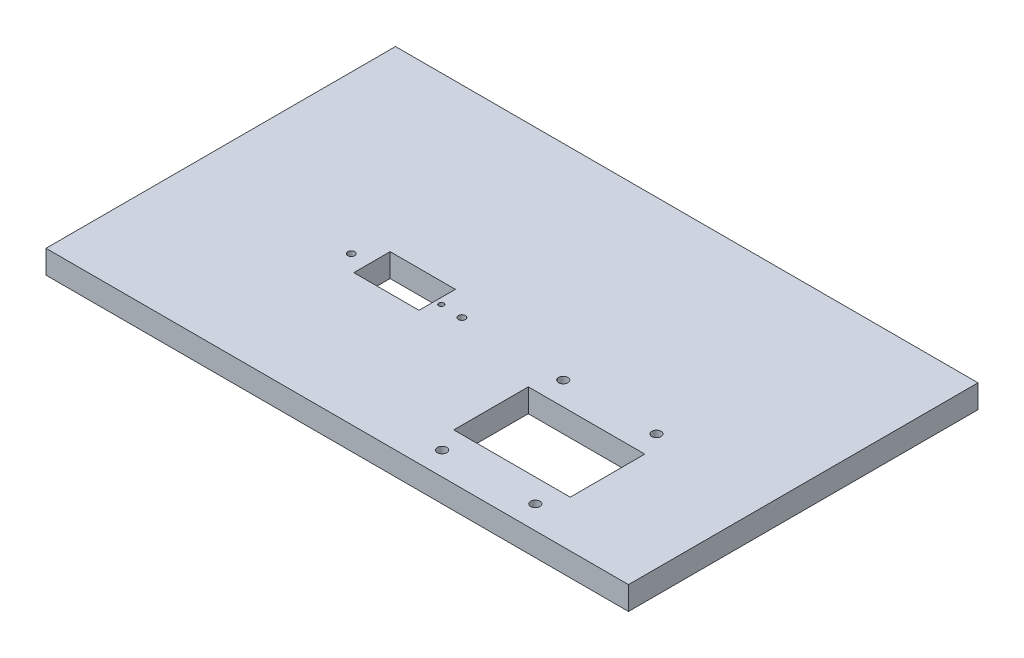
ISO-10303-21;
HEADER;
FILE_DESCRIPTION(('STEP AP214'),'2;1');
FILE_NAME('part.step','',(''),(''),'','','');
FILE_SCHEMA(('AUTOMOTIVE_DESIGN { 1 0 10303 214 1 1 1 1 }'));
ENDSEC;
DATA;
#1=APPLICATION_CONTEXT('core data for automotive mechanical design processes');
#2=APPLICATION_PROTOCOL_DEFINITION('international standard','automotive_design',2000,#1);
#3=PRODUCT_CONTEXT('',#1,'mechanical');
#4=PRODUCT('Part','Part','',(#3));
#5=PRODUCT_RELATED_PRODUCT_CATEGORY('part','',(#4));
#6=PRODUCT_DEFINITION_FORMATION('','',#4);
#7=PRODUCT_DEFINITION_CONTEXT('part definition',#1,'design');
#8=PRODUCT_DEFINITION('design','',#6,#7);
#9=PRODUCT_DEFINITION_SHAPE('','',#8);
#10=(LENGTH_UNIT() NAMED_UNIT(*) SI_UNIT(.MILLI.,.METRE.));
#11=(NAMED_UNIT(*) PLANE_ANGLE_UNIT() SI_UNIT($,.RADIAN.));
#12=(NAMED_UNIT(*) SI_UNIT($,.STERADIAN.) SOLID_ANGLE_UNIT());
#13=UNCERTAINTY_MEASURE_WITH_UNIT(LENGTH_MEASURE(1.E-05),#10,'distance_accuracy_value','');
#14=(GEOMETRIC_REPRESENTATION_CONTEXT(3) GLOBAL_UNCERTAINTY_ASSIGNED_CONTEXT((#13)) GLOBAL_UNIT_ASSIGNED_CONTEXT((#10,
#11,#12)) REPRESENTATION_CONTEXT('',''));
#15=CARTESIAN_POINT('',(0.,0.,0.));
#16=DIRECTION('',(0.,0.,1.));
#17=DIRECTION('',(1.,0.,0.));
#18=AXIS2_PLACEMENT_3D('',#15,#16,#17);
#19=CARTESIAN_POINT('',(125.,10.,-75.));
#20=DIRECTION('',(-1.,0.,0.));
#21=DIRECTION('',(0.,0.,1.));
#22=AXIS2_PLACEMENT_3D('',#19,#20,#21);
#23=PLANE('',#22);
#24=DIRECTION('',(0.,0.,-1.));
#25=VECTOR('',#24,1.);
#26=CARTESIAN_POINT('',(125.,0.,-75.));
#27=LINE('',#26,#25);
#28=CARTESIAN_POINT('',(125.,0.,75.));
#29=VERTEX_POINT('',#28);
#30=CARTESIAN_POINT('',(125.,0.,-75.));
#31=VERTEX_POINT('',#30);
#32=EDGE_CURVE('E258',#29,#31,#27,.T.);
#33=ORIENTED_EDGE('',*,*,#32,.T.);
#34=DIRECTION('',(0.,-1.,0.));
#35=VECTOR('',#34,1.);
#36=CARTESIAN_POINT('',(125.,10.,-75.));
#37=LINE('',#36,#35);
#38=CARTESIAN_POINT('',(125.,10.,-75.));
#39=VERTEX_POINT('',#38);
#40=EDGE_CURVE('E11',#39,#31,#37,.T.);
#41=ORIENTED_EDGE('',*,*,#40,.F.);
#42=DIRECTION('',(0.,0.,-1.));
#43=VECTOR('',#42,1.);
#44=CARTESIAN_POINT('',(125.,10.,-75.));
#45=LINE('',#44,#43);
#46=CARTESIAN_POINT('',(125.,10.,75.));
#47=VERTEX_POINT('',#46);
#48=EDGE_CURVE('E262',#47,#39,#45,.T.);
#49=ORIENTED_EDGE('',*,*,#48,.F.);
#50=DIRECTION('',(0.,-1.,0.));
#51=VECTOR('',#50,1.);
#52=CARTESIAN_POINT('',(125.,10.,75.));
#53=LINE('',#52,#51);
#54=EDGE_CURVE('E276',#47,#29,#53,.T.);
#55=ORIENTED_EDGE('',*,*,#54,.T.);
#56=EDGE_LOOP('',(#33,#41,#49,#55));
#57=FACE_BOUND('',#56,.T.);
#58=ADVANCED_FACE('F44',(#57),#23,.F.);
#59=CARTESIAN_POINT('',(-125.,10.,-75.));
#60=DIRECTION('',(0.,0.,1.));
#61=DIRECTION('',(1.,0.,0.));
#62=AXIS2_PLACEMENT_3D('',#59,#60,#61);
#63=PLANE('',#62);
#64=DIRECTION('',(-1.,0.,0.));
#65=VECTOR('',#64,1.);
#66=CARTESIAN_POINT('',(-125.,0.,-75.));
#67=LINE('',#66,#65);
#68=CARTESIAN_POINT('',(-125.,0.,-75.));
#69=VERTEX_POINT('',#68);
#70=EDGE_CURVE('E280',#31,#69,#67,.T.);
#71=ORIENTED_EDGE('',*,*,#70,.T.);
#72=DIRECTION('',(0.,-1.,0.));
#73=VECTOR('',#72,1.);
#74=CARTESIAN_POINT('',(-125.,10.,-75.));
#75=LINE('',#74,#73);
#76=CARTESIAN_POINT('',(-125.,10.,-75.));
#77=VERTEX_POINT('',#76);
#78=EDGE_CURVE('E52',#77,#69,#75,.T.);
#79=ORIENTED_EDGE('',*,*,#78,.F.);
#80=DIRECTION('',(-1.,0.,0.));
#81=VECTOR('',#80,1.);
#82=CARTESIAN_POINT('',(-125.,10.,-75.));
#83=LINE('',#82,#81);
#84=EDGE_CURVE('E266',#39,#77,#83,.T.);
#85=ORIENTED_EDGE('',*,*,#84,.F.);
#86=ORIENTED_EDGE('',*,*,#40,.T.);
#87=EDGE_LOOP('',(#71,#79,#85,#86));
#88=FACE_BOUND('',#87,.T.);
#89=ADVANCED_FACE('F315',(#88),#63,.F.);
#90=CARTESIAN_POINT('',(-125.,10.,-75.));
#91=DIRECTION('',(1.,0.,0.));
#92=DIRECTION('',(0.,0.,-1.));
#93=AXIS2_PLACEMENT_3D('',#90,#91,#92);
#94=PLANE('',#93);
#95=DIRECTION('',(0.,0.,1.));
#96=VECTOR('',#95,1.);
#97=CARTESIAN_POINT('',(-125.,0.,-75.));
#98=LINE('',#97,#96);
#99=CARTESIAN_POINT('',(-125.,0.,75.));
#100=VERTEX_POINT('',#99);
#101=EDGE_CURVE('E283',#69,#100,#98,.T.);
#102=ORIENTED_EDGE('',*,*,#101,.T.);
#103=DIRECTION('',(0.,-1.,0.));
#104=VECTOR('',#103,1.);
#105=CARTESIAN_POINT('',(-125.,10.,75.));
#106=LINE('',#105,#104);
#107=CARTESIAN_POINT('',(-125.,10.,75.));
#108=VERTEX_POINT('',#107);
#109=EDGE_CURVE('E291',#108,#100,#106,.T.);
#110=ORIENTED_EDGE('',*,*,#109,.F.);
#111=DIRECTION('',(0.,0.,1.));
#112=VECTOR('',#111,1.);
#113=CARTESIAN_POINT('',(-125.,10.,-75.));
#114=LINE('',#113,#112);
#115=EDGE_CURVE('E270',#77,#108,#114,.T.);
#116=ORIENTED_EDGE('',*,*,#115,.F.);
#117=ORIENTED_EDGE('',*,*,#78,.T.);
#118=EDGE_LOOP('',(#102,#110,#116,#117));
#119=FACE_BOUND('',#118,.T.);
#120=ADVANCED_FACE('F300',(#119),#94,.F.);
#121=CARTESIAN_POINT('',(-125.,10.,75.));
#122=DIRECTION('',(0.,0.,-1.));
#123=DIRECTION('',(-1.,0.,0.));
#124=AXIS2_PLACEMENT_3D('',#121,#122,#123);
#125=PLANE('',#124);
#126=DIRECTION('',(1.,0.,0.));
#127=VECTOR('',#126,1.);
#128=CARTESIAN_POINT('',(-125.,0.,75.));
#129=LINE('',#128,#127);
#130=EDGE_CURVE('E267',#100,#29,#129,.T.);
#131=ORIENTED_EDGE('',*,*,#130,.T.);
#132=ORIENTED_EDGE('',*,*,#54,.F.);
#133=DIRECTION('',(1.,0.,0.));
#134=VECTOR('',#133,1.);
#135=CARTESIAN_POINT('',(-125.,10.,75.));
#136=LINE('',#135,#134);
#137=EDGE_CURVE('E273',#108,#47,#136,.T.);
#138=ORIENTED_EDGE('',*,*,#137,.F.);
#139=ORIENTED_EDGE('',*,*,#109,.T.);
#140=EDGE_LOOP('',(#131,#132,#138,#139));
#141=FACE_BOUND('',#140,.T.);
#142=ADVANCED_FACE('F308',(#141),#125,.F.);
#143=CARTESIAN_POINT('',(0.,10.,0.));
#144=DIRECTION('',(0.,1.,0.));
#145=DIRECTION('',(0.,0.,1.));
#146=AXIS2_PLACEMENT_3D('',#143,#144,#145);
#147=PLANE('',#146);
#148=CARTESIAN_POINT('',(-9.99999999999995,10.,11.5000000000015));
#149=DIRECTION('',(0.,1.,0.));
#150=DIRECTION('',(0.,0.,1.));
#151=AXIS2_PLACEMENT_3D('',#148,#149,#150);
#152=CIRCLE('',#151,1.5);
#153=CARTESIAN_POINT('',(-9.99999999999995,10.,13.0000000000015));
#154=VERTEX_POINT('',#153);
#155=EDGE_CURVE('E392',#154,#154,#152,.T.);
#156=ORIENTED_EDGE('',*,*,#155,.F.);
#157=EDGE_LOOP('',(#156));
#158=FACE_BOUND('',#157,.T.);
#159=CARTESIAN_POINT('',(-57.5,10.,11.5000000000015));
#160=DIRECTION('',(0.,1.,0.));
#161=DIRECTION('',(0.,0.,1.));
#162=AXIS2_PLACEMENT_3D('',#159,#160,#161);
#163=CIRCLE('',#162,1.5);
#164=CARTESIAN_POINT('',(-57.5,10.,13.0000000000015));
#165=VERTEX_POINT('',#164);
#166=EDGE_CURVE('E394',#165,#165,#163,.T.);
#167=ORIENTED_EDGE('',*,*,#166,.F.);
#168=EDGE_LOOP('',(#167));
#169=FACE_BOUND('',#168,.T.);
#170=CARTESIAN_POINT('',(-19.2999999999998,10.,11.0500000000016));
#171=DIRECTION('',(0.,1.,0.));
#172=DIRECTION('',(0.,0.,1.));
#173=AXIS2_PLACEMENT_3D('',#170,#171,#172);
#174=CIRCLE('',#173,1.09999999999999);
#175=CARTESIAN_POINT('',(-19.2999999999998,10.,12.1500000000015));
#176=VERTEX_POINT('',#175);
#177=EDGE_CURVE('E405',#176,#176,#174,.T.);
#178=ORIENTED_EDGE('',*,*,#177,.F.);
#179=EDGE_LOOP('',(#178));
#180=FACE_BOUND('',#179,.T.);
#181=DIRECTION('',(0.,0.,1.));
#182=VECTOR('',#181,1.);
#183=CARTESIAN_POINT('',(-49.8999999999999,10.,2.40283488436767));
#184=LINE('',#183,#182);
#185=CARTESIAN_POINT('',(-49.8999999999999,10.,2.40283488436767));
#186=VERTEX_POINT('',#185);
#187=CARTESIAN_POINT('',(-49.8999999999999,10.,18.0000000000015));
#188=VERTEX_POINT('',#187);
#189=EDGE_CURVE('E59',#186,#188,#184,.T.);
#190=ORIENTED_EDGE('',*,*,#189,.F.);
#191=DIRECTION('',(-1.,0.,0.));
#192=VECTOR('',#191,1.);
#193=CARTESIAN_POINT('',(-49.8999999999999,10.,2.40283488436767));
#194=LINE('',#193,#192);
#195=CARTESIAN_POINT('',(-21.9,10.,2.40283488436767));
#196=VERTEX_POINT('',#195);
#197=EDGE_CURVE('E154',#196,#186,#194,.T.);
#198=ORIENTED_EDGE('',*,*,#197,.F.);
#199=DIRECTION('',(0.,0.,-1.));
#200=VECTOR('',#199,1.);
#201=CARTESIAN_POINT('',(-21.9,10.,2.40283488436767));
#202=LINE('',#201,#200);
#203=CARTESIAN_POINT('',(-21.8999999999999,10.,18.0000000000015));
#204=VERTEX_POINT('',#203);
#205=EDGE_CURVE('E158',#204,#196,#202,.T.);
#206=ORIENTED_EDGE('',*,*,#205,.F.);
#207=DIRECTION('',(1.,0.,0.));
#208=VECTOR('',#207,1.);
#209=CARTESIAN_POINT('',(-49.8999999999999,10.,18.0000000000015));
#210=LINE('',#209,#208);
#211=EDGE_CURVE('E170',#188,#204,#210,.T.);
#212=ORIENTED_EDGE('',*,*,#211,.F.);
#213=EDGE_LOOP('',(#190,#198,#206,#212));
#214=FACE_BOUND('',#213,.T.);
#215=CARTESIAN_POINT('',(75.0000000000002,10.,12.9999999999999));
#216=DIRECTION('',(0.,1.,0.));
#217=DIRECTION('',(0.,0.,1.));
#218=AXIS2_PLACEMENT_3D('',#215,#216,#217);
#219=CIRCLE('',#218,2.);
#220=CARTESIAN_POINT('',(75.0000000000002,10.,14.9999999999999));
#221=VERTEX_POINT('',#220);
#222=EDGE_CURVE('E238',#221,#221,#219,.T.);
#223=ORIENTED_EDGE('',*,*,#222,.F.);
#224=EDGE_LOOP('',(#223));
#225=FACE_BOUND('',#224,.T.);
#226=CARTESIAN_POINT('',(35.0000000000002,10.,64.9999999999999));
#227=DIRECTION('',(0.,1.,0.));
#228=DIRECTION('',(0.,0.,1.));
#229=AXIS2_PLACEMENT_3D('',#226,#227,#228);
#230=CIRCLE('',#229,2.);
#231=CARTESIAN_POINT('',(35.0000000000002,10.,66.9999999999999));
#232=VERTEX_POINT('',#231);
#233=EDGE_CURVE('E247',#232,#232,#230,.T.);
#234=ORIENTED_EDGE('',*,*,#233,.F.);
#235=EDGE_LOOP('',(#234));
#236=FACE_BOUND('',#235,.T.);
#237=CARTESIAN_POINT('',(75.0000000000002,10.,64.9999999999999));
#238=DIRECTION('',(0.,1.,0.));
#239=DIRECTION('',(0.,0.,1.));
#240=AXIS2_PLACEMENT_3D('',#237,#238,#239);
#241=CIRCLE('',#240,2.);
#242=CARTESIAN_POINT('',(75.0000000000002,10.,66.9999999999999));
#243=VERTEX_POINT('',#242);
#244=EDGE_CURVE('E186',#243,#243,#241,.T.);
#245=ORIENTED_EDGE('',*,*,#244,.F.);
#246=EDGE_LOOP('',(#245));
#247=FACE_BOUND('',#246,.T.);
#248=DIRECTION('',(0.,0.,1.));
#249=VECTOR('',#248,1.);
#250=CARTESIAN_POINT('',(30.0000000000002,10.,22.9999999999999));
#251=LINE('',#250,#249);
#252=CARTESIAN_POINT('',(30.0000000000002,10.,22.9999999999999));
#253=VERTEX_POINT('',#252);
#254=CARTESIAN_POINT('',(30.0000000000002,10.,54.9999999999999));
#255=VERTEX_POINT('',#254);
#256=EDGE_CURVE('E195',#253,#255,#251,.T.);
#257=ORIENTED_EDGE('',*,*,#256,.F.);
#258=DIRECTION('',(-1.,0.,0.));
#259=VECTOR('',#258,1.);
#260=CARTESIAN_POINT('',(30.0000000000002,10.,22.9999999999999));
#261=LINE('',#260,#259);
#262=CARTESIAN_POINT('',(80.0000000000002,10.,22.9999999999999));
#263=VERTEX_POINT('',#262);
#264=EDGE_CURVE('E209',#263,#253,#261,.T.);
#265=ORIENTED_EDGE('',*,*,#264,.F.);
#266=DIRECTION('',(0.,0.,-1.));
#267=VECTOR('',#266,1.);
#268=CARTESIAN_POINT('',(80.0000000000002,10.,22.9999999999999));
#269=LINE('',#268,#267);
#270=CARTESIAN_POINT('',(80.0000000000002,10.,54.9999999999999));
#271=VERTEX_POINT('',#270);
#272=EDGE_CURVE('E213',#271,#263,#269,.T.);
#273=ORIENTED_EDGE('',*,*,#272,.F.);
#274=DIRECTION('',(1.,0.,0.));
#275=VECTOR('',#274,1.);
#276=CARTESIAN_POINT('',(30.0000000000002,10.,54.9999999999999));
#277=LINE('',#276,#275);
#278=EDGE_CURVE('E218',#255,#271,#277,.T.);
#279=ORIENTED_EDGE('',*,*,#278,.F.);
#280=EDGE_LOOP('',(#257,#265,#273,#279));
#281=FACE_BOUND('',#280,.T.);
#282=CARTESIAN_POINT('',(35.0000000000002,10.,12.9999999999999));
#283=DIRECTION('',(0.,1.,0.));
#284=DIRECTION('',(0.,0.,1.));
#285=AXIS2_PLACEMENT_3D('',#282,#283,#284);
#286=CIRCLE('',#285,2.);
#287=CARTESIAN_POINT('',(35.0000000000002,10.,14.9999999999999));
#288=VERTEX_POINT('',#287);
#289=EDGE_CURVE('E242',#288,#288,#286,.T.);
#290=ORIENTED_EDGE('',*,*,#289,.F.);
#291=EDGE_LOOP('',(#290));
#292=FACE_BOUND('',#291,.T.);
#293=ORIENTED_EDGE('',*,*,#48,.T.);
#294=ORIENTED_EDGE('',*,*,#84,.T.);
#295=ORIENTED_EDGE('',*,*,#115,.T.);
#296=ORIENTED_EDGE('',*,*,#137,.T.);
#297=EDGE_LOOP('',(#293,#294,#295,#296));
#298=FACE_BOUND('',#297,.T.);
#299=ADVANCED_FACE('F314',(#158,#169,#180,#214,#225,#236,#247,#281,#292,#298),#147,.T.);
#300=CARTESIAN_POINT('',(0.,0.,0.));
#301=DIRECTION('',(0.,1.,0.));
#302=DIRECTION('',(0.,0.,1.));
#303=AXIS2_PLACEMENT_3D('',#300,#301,#302);
#304=PLANE('',#303);
#305=CARTESIAN_POINT('',(-9.99999999999995,0.,11.5000000000015));
#306=DIRECTION('',(0.,1.,0.));
#307=DIRECTION('',(0.,0.,1.));
#308=AXIS2_PLACEMENT_3D('',#305,#306,#307);
#309=CIRCLE('',#308,1.5);
#310=CARTESIAN_POINT('',(-9.99999999999995,0.,13.0000000000015));
#311=VERTEX_POINT('',#310);
#312=EDGE_CURVE('E171',#311,#311,#309,.T.);
#313=ORIENTED_EDGE('',*,*,#312,.T.);
#314=EDGE_LOOP('',(#313));
#315=FACE_BOUND('',#314,.T.);
#316=CARTESIAN_POINT('',(-57.5,0.,11.5000000000015));
#317=DIRECTION('',(0.,1.,0.));
#318=DIRECTION('',(0.,0.,1.));
#319=AXIS2_PLACEMENT_3D('',#316,#317,#318);
#320=CIRCLE('',#319,1.5);
#321=CARTESIAN_POINT('',(-57.5,0.,13.0000000000015));
#322=VERTEX_POINT('',#321);
#323=EDGE_CURVE('E400',#322,#322,#320,.T.);
#324=ORIENTED_EDGE('',*,*,#323,.T.);
#325=EDGE_LOOP('',(#324));
#326=FACE_BOUND('',#325,.T.);
#327=CARTESIAN_POINT('',(-19.2999999999998,0.,11.0500000000016));
#328=DIRECTION('',(0.,1.,0.));
#329=DIRECTION('',(0.,0.,1.));
#330=AXIS2_PLACEMENT_3D('',#327,#328,#329);
#331=CIRCLE('',#330,1.09999999999999);
#332=CARTESIAN_POINT('',(-19.2999999999998,0.,12.1500000000015));
#333=VERTEX_POINT('',#332);
#334=EDGE_CURVE('E161',#333,#333,#331,.T.);
#335=ORIENTED_EDGE('',*,*,#334,.T.);
#336=EDGE_LOOP('',(#335));
#337=FACE_BOUND('',#336,.T.);
#338=DIRECTION('',(-1.,0.,0.));
#339=VECTOR('',#338,1.);
#340=CARTESIAN_POINT('',(-49.8999999999999,0.,2.40283488436767));
#341=LINE('',#340,#339);
#342=CARTESIAN_POINT('',(-21.9,0.,2.40283488436767));
#343=VERTEX_POINT('',#342);
#344=CARTESIAN_POINT('',(-49.8999999999999,0.,2.40283488436767));
#345=VERTEX_POINT('',#344);
#346=EDGE_CURVE('E142',#343,#345,#341,.T.);
#347=ORIENTED_EDGE('',*,*,#346,.T.);
#348=DIRECTION('',(0.,0.,1.));
#349=VECTOR('',#348,1.);
#350=CARTESIAN_POINT('',(-49.8999999999999,0.,2.40283488436767));
#351=LINE('',#350,#349);
#352=CARTESIAN_POINT('',(-49.8999999999999,0.,18.0000000000015));
#353=VERTEX_POINT('',#352);
#354=EDGE_CURVE('E135',#345,#353,#351,.T.);
#355=ORIENTED_EDGE('',*,*,#354,.T.);
#356=DIRECTION('',(1.,0.,0.));
#357=VECTOR('',#356,1.);
#358=CARTESIAN_POINT('',(-49.8999999999999,0.,18.0000000000015));
#359=LINE('',#358,#357);
#360=CARTESIAN_POINT('',(-21.8999999999999,0.,18.0000000000015));
#361=VERTEX_POINT('',#360);
#362=EDGE_CURVE('E145',#353,#361,#359,.T.);
#363=ORIENTED_EDGE('',*,*,#362,.T.);
#364=DIRECTION('',(0.,0.,-1.));
#365=VECTOR('',#364,1.);
#366=CARTESIAN_POINT('',(-21.9,0.,2.40283488436767));
#367=LINE('',#366,#365);
#368=EDGE_CURVE('E67',#361,#343,#367,.T.);
#369=ORIENTED_EDGE('',*,*,#368,.T.);
#370=EDGE_LOOP('',(#347,#355,#363,#369));
#371=FACE_BOUND('',#370,.T.);
#372=CARTESIAN_POINT('',(75.0000000000002,0.,12.9999999999999));
#373=DIRECTION('',(0.,1.,0.));
#374=DIRECTION('',(0.,0.,1.));
#375=AXIS2_PLACEMENT_3D('',#372,#373,#374);
#376=CIRCLE('',#375,2.);
#377=CARTESIAN_POINT('',(75.0000000000002,0.,14.9999999999999));
#378=VERTEX_POINT('',#377);
#379=EDGE_CURVE('E243',#378,#378,#376,.T.);
#380=ORIENTED_EDGE('',*,*,#379,.T.);
#381=EDGE_LOOP('',(#380));
#382=FACE_BOUND('',#381,.T.);
#383=CARTESIAN_POINT('',(35.0000000000002,0.,64.9999999999999));
#384=DIRECTION('',(0.,1.,0.));
#385=DIRECTION('',(0.,0.,1.));
#386=AXIS2_PLACEMENT_3D('',#383,#384,#385);
#387=CIRCLE('',#386,2.);
#388=CARTESIAN_POINT('',(35.0000000000002,0.,66.9999999999999));
#389=VERTEX_POINT('',#388);
#390=EDGE_CURVE('E190',#389,#389,#387,.T.);
#391=ORIENTED_EDGE('',*,*,#390,.T.);
#392=EDGE_LOOP('',(#391));
#393=FACE_BOUND('',#392,.T.);
#394=CARTESIAN_POINT('',(75.0000000000002,0.,64.9999999999999));
#395=DIRECTION('',(0.,1.,0.));
#396=DIRECTION('',(0.,0.,1.));
#397=AXIS2_PLACEMENT_3D('',#394,#395,#396);
#398=CIRCLE('',#397,2.);
#399=CARTESIAN_POINT('',(75.0000000000002,0.,66.9999999999999));
#400=VERTEX_POINT('',#399);
#401=EDGE_CURVE('E191',#400,#400,#398,.T.);
#402=ORIENTED_EDGE('',*,*,#401,.T.);
#403=EDGE_LOOP('',(#402));
#404=FACE_BOUND('',#403,.T.);
#405=DIRECTION('',(-1.,0.,0.));
#406=VECTOR('',#405,1.);
#407=CARTESIAN_POINT('',(30.0000000000002,0.,22.9999999999999));
#408=LINE('',#407,#406);
#409=CARTESIAN_POINT('',(80.0000000000002,0.,22.9999999999999));
#410=VERTEX_POINT('',#409);
#411=CARTESIAN_POINT('',(30.0000000000002,0.,22.9999999999999));
#412=VERTEX_POINT('',#411);
#413=EDGE_CURVE('E200',#410,#412,#408,.T.);
#414=ORIENTED_EDGE('',*,*,#413,.T.);
#415=DIRECTION('',(0.,0.,1.));
#416=VECTOR('',#415,1.);
#417=CARTESIAN_POINT('',(30.0000000000002,0.,22.9999999999999));
#418=LINE('',#417,#416);
#419=CARTESIAN_POINT('',(30.0000000000002,0.,54.9999999999999));
#420=VERTEX_POINT('',#419);
#421=EDGE_CURVE('E214',#412,#420,#418,.T.);
#422=ORIENTED_EDGE('',*,*,#421,.T.);
#423=DIRECTION('',(1.,0.,0.));
#424=VECTOR('',#423,1.);
#425=CARTESIAN_POINT('',(30.0000000000002,0.,54.9999999999999));
#426=LINE('',#425,#424);
#427=CARTESIAN_POINT('',(80.0000000000002,0.,54.9999999999999));
#428=VERTEX_POINT('',#427);
#429=EDGE_CURVE('E231',#420,#428,#426,.T.);
#430=ORIENTED_EDGE('',*,*,#429,.T.);
#431=DIRECTION('',(0.,0.,-1.));
#432=VECTOR('',#431,1.);
#433=CARTESIAN_POINT('',(80.0000000000002,0.,22.9999999999999));
#434=LINE('',#433,#432);
#435=EDGE_CURVE('E227',#428,#410,#434,.T.);
#436=ORIENTED_EDGE('',*,*,#435,.T.);
#437=EDGE_LOOP('',(#414,#422,#430,#436));
#438=FACE_BOUND('',#437,.T.);
#439=CARTESIAN_POINT('',(35.0000000000002,0.,12.9999999999999));
#440=DIRECTION('',(0.,1.,0.));
#441=DIRECTION('',(0.,0.,1.));
#442=AXIS2_PLACEMENT_3D('',#439,#440,#441);
#443=CIRCLE('',#442,2.);
#444=CARTESIAN_POINT('',(35.0000000000002,0.,14.9999999999999));
#445=VERTEX_POINT('',#444);
#446=EDGE_CURVE('E254',#445,#445,#443,.T.);
#447=ORIENTED_EDGE('',*,*,#446,.T.);
#448=EDGE_LOOP('',(#447));
#449=FACE_BOUND('',#448,.T.);
#450=ORIENTED_EDGE('',*,*,#32,.F.);
#451=ORIENTED_EDGE('',*,*,#130,.F.);
#452=ORIENTED_EDGE('',*,*,#101,.F.);
#453=ORIENTED_EDGE('',*,*,#70,.F.);
#454=EDGE_LOOP('',(#450,#451,#452,#453));
#455=FACE_BOUND('',#454,.T.);
#456=ADVANCED_FACE('F150',(#315,#326,#337,#371,#382,#393,#404,#438,#449,#455),#304,.F.);
#457=CARTESIAN_POINT('',(35.0000000000002,0.,12.9999999999999));
#458=DIRECTION('',(0.,1.,0.));
#459=DIRECTION('',(0.,0.,1.));
#460=AXIS2_PLACEMENT_3D('',#457,#458,#459);
#461=CYLINDRICAL_SURFACE('',#460,2.);
#462=ORIENTED_EDGE('',*,*,#446,.F.);
#463=EDGE_LOOP('',(#462));
#464=FACE_BOUND('',#463,.T.);
#465=ORIENTED_EDGE('',*,*,#289,.T.);
#466=EDGE_LOOP('',(#465));
#467=FACE_BOUND('',#466,.T.);
#468=ADVANCED_FACE('F327',(#464,#467),#461,.F.);
#469=CARTESIAN_POINT('',(30.0000000000002,0.,22.9999999999999));
#470=DIRECTION('',(-1.,0.,0.));
#471=DIRECTION('',(0.,0.,1.));
#472=AXIS2_PLACEMENT_3D('',#469,#470,#471);
#473=PLANE('',#472);
#474=ORIENTED_EDGE('',*,*,#256,.T.);
#475=DIRECTION('',(0.,1.,0.));
#476=VECTOR('',#475,1.);
#477=CARTESIAN_POINT('',(30.0000000000002,0.,54.9999999999999));
#478=LINE('',#477,#476);
#479=EDGE_CURVE('E196',#420,#255,#478,.T.);
#480=ORIENTED_EDGE('',*,*,#479,.F.);
#481=ORIENTED_EDGE('',*,*,#421,.F.);
#482=DIRECTION('',(0.,1.,0.));
#483=VECTOR('',#482,1.);
#484=CARTESIAN_POINT('',(30.0000000000002,0.,22.9999999999999));
#485=LINE('',#484,#483);
#486=EDGE_CURVE('E180',#412,#253,#485,.T.);
#487=ORIENTED_EDGE('',*,*,#486,.T.);
#488=EDGE_LOOP('',(#474,#480,#481,#487));
#489=FACE_BOUND('',#488,.T.);
#490=ADVANCED_FACE('F334',(#489),#473,.F.);
#491=CARTESIAN_POINT('',(30.0000000000002,0.,22.9999999999999));
#492=DIRECTION('',(0.,0.,-1.));
#493=DIRECTION('',(-1.,0.,0.));
#494=AXIS2_PLACEMENT_3D('',#491,#492,#493);
#495=PLANE('',#494);
#496=ORIENTED_EDGE('',*,*,#264,.T.);
#497=ORIENTED_EDGE('',*,*,#486,.F.);
#498=ORIENTED_EDGE('',*,*,#413,.F.);
#499=DIRECTION('',(0.,1.,0.));
#500=VECTOR('',#499,1.);
#501=CARTESIAN_POINT('',(80.0000000000002,0.,22.9999999999999));
#502=LINE('',#501,#500);
#503=EDGE_CURVE('E204',#410,#263,#502,.T.);
#504=ORIENTED_EDGE('',*,*,#503,.T.);
#505=EDGE_LOOP('',(#496,#497,#498,#504));
#506=FACE_BOUND('',#505,.T.);
#507=ADVANCED_FACE('F345',(#506),#495,.F.);
#508=CARTESIAN_POINT('',(80.0000000000002,0.,22.9999999999999));
#509=DIRECTION('',(1.,0.,0.));
#510=DIRECTION('',(0.,0.,-1.));
#511=AXIS2_PLACEMENT_3D('',#508,#509,#510);
#512=PLANE('',#511);
#513=ORIENTED_EDGE('',*,*,#272,.T.);
#514=ORIENTED_EDGE('',*,*,#503,.F.);
#515=ORIENTED_EDGE('',*,*,#435,.F.);
#516=DIRECTION('',(0.,1.,0.));
#517=VECTOR('',#516,1.);
#518=CARTESIAN_POINT('',(80.0000000000002,0.,54.9999999999999));
#519=LINE('',#518,#517);
#520=EDGE_CURVE('E201',#428,#271,#519,.T.);
#521=ORIENTED_EDGE('',*,*,#520,.T.);
#522=EDGE_LOOP('',(#513,#514,#515,#521));
#523=FACE_BOUND('',#522,.T.);
#524=ADVANCED_FACE('F348',(#523),#512,.F.);
#525=CARTESIAN_POINT('',(30.0000000000002,0.,54.9999999999999));
#526=DIRECTION('',(0.,0.,1.));
#527=DIRECTION('',(1.,0.,0.));
#528=AXIS2_PLACEMENT_3D('',#525,#526,#527);
#529=PLANE('',#528);
#530=ORIENTED_EDGE('',*,*,#278,.T.);
#531=ORIENTED_EDGE('',*,*,#520,.F.);
#532=ORIENTED_EDGE('',*,*,#429,.F.);
#533=ORIENTED_EDGE('',*,*,#479,.T.);
#534=EDGE_LOOP('',(#530,#531,#532,#533));
#535=FACE_BOUND('',#534,.T.);
#536=ADVANCED_FACE('F352',(#535),#529,.F.);
#537=CARTESIAN_POINT('',(75.0000000000002,0.,64.9999999999999));
#538=DIRECTION('',(0.,1.,0.));
#539=DIRECTION('',(0.,0.,1.));
#540=AXIS2_PLACEMENT_3D('',#537,#538,#539);
#541=CYLINDRICAL_SURFACE('',#540,2.);
#542=ORIENTED_EDGE('',*,*,#401,.F.);
#543=EDGE_LOOP('',(#542));
#544=FACE_BOUND('',#543,.T.);
#545=ORIENTED_EDGE('',*,*,#244,.T.);
#546=EDGE_LOOP('',(#545));
#547=FACE_BOUND('',#546,.T.);
#548=ADVANCED_FACE('F340',(#544,#547),#541,.F.);
#549=CARTESIAN_POINT('',(35.0000000000002,0.,64.9999999999999));
#550=DIRECTION('',(0.,1.,0.));
#551=DIRECTION('',(0.,0.,1.));
#552=AXIS2_PLACEMENT_3D('',#549,#550,#551);
#553=CYLINDRICAL_SURFACE('',#552,2.);
#554=ORIENTED_EDGE('',*,*,#390,.F.);
#555=EDGE_LOOP('',(#554));
#556=FACE_BOUND('',#555,.T.);
#557=ORIENTED_EDGE('',*,*,#233,.T.);
#558=EDGE_LOOP('',(#557));
#559=FACE_BOUND('',#558,.T.);
#560=ADVANCED_FACE('F336',(#556,#559),#553,.F.);
#561=CARTESIAN_POINT('',(75.0000000000002,0.,12.9999999999999));
#562=DIRECTION('',(0.,1.,0.));
#563=DIRECTION('',(0.,0.,1.));
#564=AXIS2_PLACEMENT_3D('',#561,#562,#563);
#565=CYLINDRICAL_SURFACE('',#564,2.);
#566=ORIENTED_EDGE('',*,*,#379,.F.);
#567=EDGE_LOOP('',(#566));
#568=FACE_BOUND('',#567,.T.);
#569=ORIENTED_EDGE('',*,*,#222,.T.);
#570=EDGE_LOOP('',(#569));
#571=FACE_BOUND('',#570,.T.);
#572=ADVANCED_FACE('F339',(#568,#571),#565,.F.);
#573=CARTESIAN_POINT('',(-49.8999999999999,0.,2.40283488436767));
#574=DIRECTION('',(-1.,0.,0.));
#575=DIRECTION('',(0.,0.,1.));
#576=AXIS2_PLACEMENT_3D('',#573,#574,#575);
#577=PLANE('',#576);
#578=ORIENTED_EDGE('',*,*,#189,.T.);
#579=DIRECTION('',(0.,1.,0.));
#580=VECTOR('',#579,1.);
#581=CARTESIAN_POINT('',(-49.8999999999999,0.,18.0000000000015));
#582=LINE('',#581,#580);
#583=EDGE_CURVE('E131',#353,#188,#582,.T.);
#584=ORIENTED_EDGE('',*,*,#583,.F.);
#585=ORIENTED_EDGE('',*,*,#354,.F.);
#586=DIRECTION('',(0.,1.,0.));
#587=VECTOR('',#586,1.);
#588=CARTESIAN_POINT('',(-49.8999999999999,0.,2.40283488436767));
#589=LINE('',#588,#587);
#590=EDGE_CURVE('E177',#345,#186,#589,.T.);
#591=ORIENTED_EDGE('',*,*,#590,.T.);
#592=EDGE_LOOP('',(#578,#584,#585,#591));
#593=FACE_BOUND('',#592,.T.);
#594=ADVANCED_FACE('F133',(#593),#577,.F.);
#595=CARTESIAN_POINT('',(-49.8999999999999,0.,2.40283488436767));
#596=DIRECTION('',(0.,0.,-1.));
#597=DIRECTION('',(-1.,0.,0.));
#598=AXIS2_PLACEMENT_3D('',#595,#596,#597);
#599=PLANE('',#598);
#600=ORIENTED_EDGE('',*,*,#197,.T.);
#601=ORIENTED_EDGE('',*,*,#590,.F.);
#602=ORIENTED_EDGE('',*,*,#346,.F.);
#603=DIRECTION('',(0.,1.,0.));
#604=VECTOR('',#603,1.);
#605=CARTESIAN_POINT('',(-21.9,0.,2.40283488436767));
#606=LINE('',#605,#604);
#607=EDGE_CURVE('E181',#343,#196,#606,.T.);
#608=ORIENTED_EDGE('',*,*,#607,.T.);
#609=EDGE_LOOP('',(#600,#601,#602,#608));
#610=FACE_BOUND('',#609,.T.);
#611=ADVANCED_FACE('F365',(#610),#599,.F.);
#612=CARTESIAN_POINT('',(-21.9,0.,2.40283488436767));
#613=DIRECTION('',(1.,0.,0.));
#614=DIRECTION('',(0.,0.,-1.));
#615=AXIS2_PLACEMENT_3D('',#612,#613,#614);
#616=PLANE('',#615);
#617=ORIENTED_EDGE('',*,*,#205,.T.);
#618=ORIENTED_EDGE('',*,*,#607,.F.);
#619=ORIENTED_EDGE('',*,*,#368,.F.);
#620=DIRECTION('',(0.,1.,0.));
#621=VECTOR('',#620,1.);
#622=CARTESIAN_POINT('',(-21.8999999999999,0.,18.0000000000015));
#623=LINE('',#622,#621);
#624=EDGE_CURVE('E141',#361,#204,#623,.T.);
#625=ORIENTED_EDGE('',*,*,#624,.T.);
#626=EDGE_LOOP('',(#617,#618,#619,#625));
#627=FACE_BOUND('',#626,.T.);
#628=ADVANCED_FACE('F369',(#627),#616,.F.);
#629=CARTESIAN_POINT('',(-49.8999999999999,0.,18.0000000000015));
#630=DIRECTION('',(0.,0.,1.));
#631=DIRECTION('',(1.,0.,0.));
#632=AXIS2_PLACEMENT_3D('',#629,#630,#631);
#633=PLANE('',#632);
#634=ORIENTED_EDGE('',*,*,#211,.T.);
#635=ORIENTED_EDGE('',*,*,#624,.F.);
#636=ORIENTED_EDGE('',*,*,#362,.F.);
#637=ORIENTED_EDGE('',*,*,#583,.T.);
#638=EDGE_LOOP('',(#634,#635,#636,#637));
#639=FACE_BOUND('',#638,.T.);
#640=ADVANCED_FACE('F146',(#639),#633,.F.);
#641=CARTESIAN_POINT('',(-19.2999999999998,0.,11.0500000000016));
#642=DIRECTION('',(0.,1.,0.));
#643=DIRECTION('',(0.,0.,1.));
#644=AXIS2_PLACEMENT_3D('',#641,#642,#643);
#645=CYLINDRICAL_SURFACE('',#644,1.09999999999999);
#646=ORIENTED_EDGE('',*,*,#334,.F.);
#647=EDGE_LOOP('',(#646));
#648=FACE_BOUND('',#647,.T.);
#649=ORIENTED_EDGE('',*,*,#177,.T.);
#650=EDGE_LOOP('',(#649));
#651=FACE_BOUND('',#650,.T.);
#652=ADVANCED_FACE('F368',(#648,#651),#645,.F.);
#653=CARTESIAN_POINT('',(-57.5,0.,11.5000000000015));
#654=DIRECTION('',(0.,1.,0.));
#655=DIRECTION('',(0.,0.,1.));
#656=AXIS2_PLACEMENT_3D('',#653,#654,#655);
#657=CYLINDRICAL_SURFACE('',#656,1.5);
#658=ORIENTED_EDGE('',*,*,#323,.F.);
#659=EDGE_LOOP('',(#658));
#660=FACE_BOUND('',#659,.T.);
#661=ORIENTED_EDGE('',*,*,#166,.T.);
#662=EDGE_LOOP('',(#661));
#663=FACE_BOUND('',#662,.T.);
#664=ADVANCED_FACE('F377',(#660,#663),#657,.F.);
#665=CARTESIAN_POINT('',(-9.99999999999995,0.,11.5000000000015));
#666=DIRECTION('',(0.,1.,0.));
#667=DIRECTION('',(0.,0.,1.));
#668=AXIS2_PLACEMENT_3D('',#665,#666,#667);
#669=CYLINDRICAL_SURFACE('',#668,1.5);
#670=ORIENTED_EDGE('',*,*,#312,.F.);
#671=EDGE_LOOP('',(#670));
#672=FACE_BOUND('',#671,.T.);
#673=ORIENTED_EDGE('',*,*,#155,.T.);
#674=EDGE_LOOP('',(#673));
#675=FACE_BOUND('',#674,.T.);
#676=ADVANCED_FACE('F381',(#672,#675),#669,.F.);
#677=CLOSED_SHELL('',(#58,#89,#120,#142,#299,#456,#468,#490,#507,#524,#536,#548,#560,#572,#594,
#611,#628,#640,#652,#664,#676));
#678=MANIFOLD_SOLID_BREP('B2',#677);
#679=ADVANCED_BREP_SHAPE_REPRESENTATION('',(#18,#678),#14);
#680=SHAPE_DEFINITION_REPRESENTATION(#9,#679);
ENDSEC;
END-ISO-10303-21;
